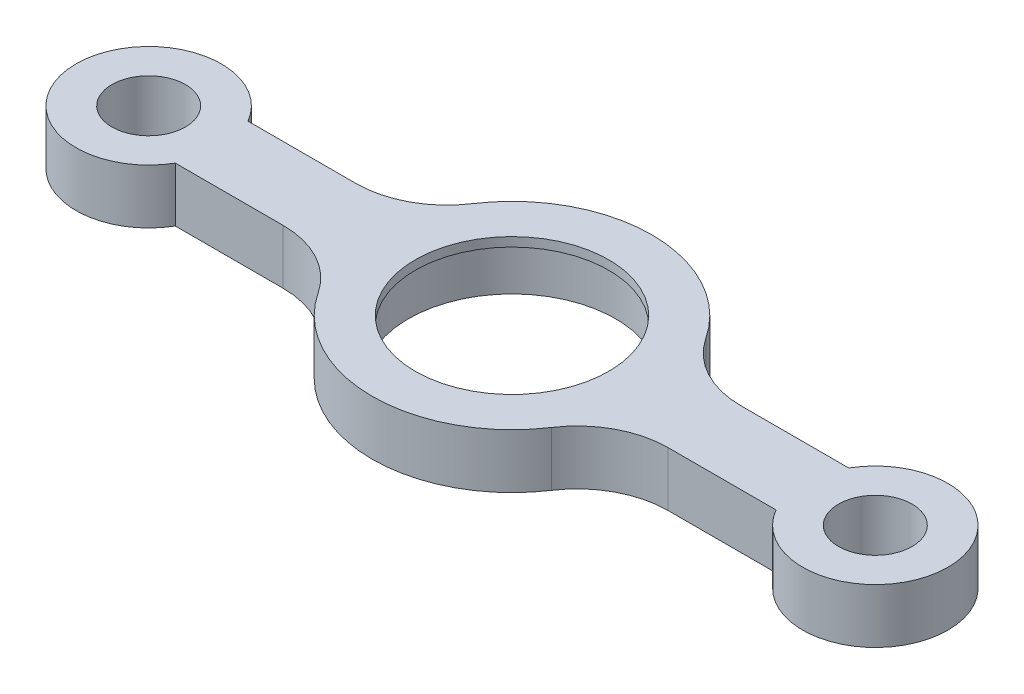
ISO-10303-21;
HEADER;
FILE_DESCRIPTION(('STEP AP214'),'2;1');
FILE_NAME('part.step','',(''),(''),'','','');
FILE_SCHEMA(('AUTOMOTIVE_DESIGN { 1 0 10303 214 1 1 1 1 }'));
ENDSEC;
DATA;
#1=APPLICATION_CONTEXT('core data for automotive mechanical design processes');
#2=APPLICATION_PROTOCOL_DEFINITION('international standard','automotive_design',2000,#1);
#3=PRODUCT_CONTEXT('',#1,'mechanical');
#4=PRODUCT('Part','Part','',(#3));
#5=PRODUCT_RELATED_PRODUCT_CATEGORY('part','',(#4));
#6=PRODUCT_DEFINITION_FORMATION('','',#4);
#7=PRODUCT_DEFINITION_CONTEXT('part definition',#1,'design');
#8=PRODUCT_DEFINITION('design','',#6,#7);
#9=PRODUCT_DEFINITION_SHAPE('','',#8);
#10=(LENGTH_UNIT() NAMED_UNIT(*) SI_UNIT(.MILLI.,.METRE.));
#11=(NAMED_UNIT(*) PLANE_ANGLE_UNIT() SI_UNIT($,.RADIAN.));
#12=(NAMED_UNIT(*) SI_UNIT($,.STERADIAN.) SOLID_ANGLE_UNIT());
#13=UNCERTAINTY_MEASURE_WITH_UNIT(LENGTH_MEASURE(1.E-05),#10,'distance_accuracy_value','');
#14=(GEOMETRIC_REPRESENTATION_CONTEXT(3) GLOBAL_UNCERTAINTY_ASSIGNED_CONTEXT((#13)) GLOBAL_UNIT_ASSIGNED_CONTEXT((#10,
#11,#12)) REPRESENTATION_CONTEXT('',''));
#15=CARTESIAN_POINT('',(0.,0.,0.));
#16=DIRECTION('',(0.,0.,1.));
#17=DIRECTION('',(1.,0.,0.));
#18=AXIS2_PLACEMENT_3D('',#15,#16,#17);
#19=CARTESIAN_POINT('',(0.,6.,0.));
#20=DIRECTION('',(0.,-1.,0.));
#21=DIRECTION('',(0.,0.,-1.));
#22=AXIS2_PLACEMENT_3D('',#19,#20,#21);
#23=CYLINDRICAL_SURFACE('',#22,11.4);
#24=CARTESIAN_POINT('',(0.,0.,0.));
#25=DIRECTION('',(0.,1.,0.));
#26=DIRECTION('',(0.,0.,1.));
#27=AXIS2_PLACEMENT_3D('',#24,#25,#26);
#28=CIRCLE('',#27,11.4);
#29=CARTESIAN_POINT('',(0.,0.,11.4));
#30=VERTEX_POINT('',#29);
#31=EDGE_CURVE('E375',#30,#30,#28,.T.);
#32=ORIENTED_EDGE('',*,*,#31,.F.);
#33=EDGE_LOOP('',(#32));
#34=FACE_BOUND('',#33,.T.);
#35=CARTESIAN_POINT('',(0.,5.,0.));
#36=DIRECTION('',(0.,1.,0.));
#37=DIRECTION('',(0.,0.,1.));
#38=AXIS2_PLACEMENT_3D('',#35,#36,#37);
#39=CIRCLE('',#38,11.4);
#40=CARTESIAN_POINT('',(0.,5.,11.4));
#41=VERTEX_POINT('',#40);
#42=EDGE_CURVE('E370',#41,#41,#39,.T.);
#43=ORIENTED_EDGE('',*,*,#42,.T.);
#44=EDGE_LOOP('',(#43));
#45=FACE_BOUND('',#44,.T.);
#46=ADVANCED_FACE('F33',(#34,#45),#23,.F.);
#47=CARTESIAN_POINT('',(-40.,6.,0.));
#48=DIRECTION('',(0.,1.,0.));
#49=DIRECTION('',(0.,0.,1.));
#50=AXIS2_PLACEMENT_3D('',#47,#48,#49);
#51=PLANE('',#50);
#52=CARTESIAN_POINT('',(-40.,6.,0.));
#53=DIRECTION('',(0.,1.,0.));
#54=DIRECTION('',(0.,0.,1.));
#55=AXIS2_PLACEMENT_3D('',#52,#53,#54);
#56=CIRCLE('',#55,4.05);
#57=CARTESIAN_POINT('',(-40.,6.,4.05));
#58=VERTEX_POINT('',#57);
#59=EDGE_CURVE('E379',#58,#58,#56,.T.);
#60=ORIENTED_EDGE('',*,*,#59,.F.);
#61=EDGE_LOOP('',(#60));
#62=FACE_BOUND('',#61,.T.);
#63=CARTESIAN_POINT('',(-40.,6.,0.));
#64=DIRECTION('',(0.,1.,0.));
#65=DIRECTION('',(0.,0.,1.));
#66=AXIS2_PLACEMENT_3D('',#63,#64,#65);
#67=CIRCLE('',#66,8.00000000000001);
#68=CARTESIAN_POINT('',(-33.0717967697245,6.,-3.99999999999998));
#69=VERTEX_POINT('',#68);
#70=CARTESIAN_POINT('',(-33.0717967697245,6.,4.));
#71=VERTEX_POINT('',#70);
#72=EDGE_CURVE('E178',#69,#71,#67,.T.);
#73=ORIENTED_EDGE('',*,*,#72,.T.);
#74=DIRECTION('',(1.,0.,0.));
#75=VECTOR('',#74,1.);
#76=CARTESIAN_POINT('',(-33.0717967697245,6.,4.));
#77=LINE('',#76,#75);
#78=CARTESIAN_POINT('',(-21.193395197561,6.,4.));
#79=VERTEX_POINT('',#78);
#80=EDGE_CURVE('E105',#71,#79,#77,.T.);
#81=ORIENTED_EDGE('',*,*,#80,.T.);
#82=CARTESIAN_POINT('',(-21.193395197561,6.,14.));
#83=DIRECTION('',(0.,-1.,0.));
#84=DIRECTION('',(0.,0.,1.));
#85=AXIS2_PLACEMENT_3D('',#82,#83,#84);
#86=CIRCLE('',#85,10.);
#87=CARTESIAN_POINT('',(-12.8495388205685,6.,8.48818897637796));
#88=VERTEX_POINT('',#87);
#89=EDGE_CURVE('E205',#79,#88,#86,.T.);
#90=ORIENTED_EDGE('',*,*,#89,.T.);
#91=CARTESIAN_POINT('',(0.,6.,0.));
#92=DIRECTION('',(0.,1.,0.));
#93=DIRECTION('',(0.,0.,1.));
#94=AXIS2_PLACEMENT_3D('',#91,#92,#93);
#95=CIRCLE('',#94,15.4);
#96=CARTESIAN_POINT('',(12.8495388205685,6.,8.48818897637795));
#97=VERTEX_POINT('',#96);
#98=EDGE_CURVE('E224',#88,#97,#95,.T.);
#99=ORIENTED_EDGE('',*,*,#98,.T.);
#100=CARTESIAN_POINT('',(21.193395197561,6.,14.));
#101=DIRECTION('',(0.,-1.,0.));
#102=DIRECTION('',(0.,0.,1.));
#103=AXIS2_PLACEMENT_3D('',#100,#101,#102);
#104=CIRCLE('',#103,10.);
#105=CARTESIAN_POINT('',(21.193395197561,6.,4.));
#106=VERTEX_POINT('',#105);
#107=EDGE_CURVE('E221',#97,#106,#104,.T.);
#108=ORIENTED_EDGE('',*,*,#107,.T.);
#109=DIRECTION('',(1.,0.,0.));
#110=VECTOR('',#109,1.);
#111=CARTESIAN_POINT('',(21.193395197561,6.,4.));
#112=LINE('',#111,#110);
#113=CARTESIAN_POINT('',(33.0717967697245,6.,3.99999999999999));
#114=VERTEX_POINT('',#113);
#115=EDGE_CURVE('E223',#106,#114,#112,.T.);
#116=ORIENTED_EDGE('',*,*,#115,.T.);
#117=CARTESIAN_POINT('',(40.,6.,0.));
#118=DIRECTION('',(0.,1.,0.));
#119=DIRECTION('',(0.,0.,1.));
#120=AXIS2_PLACEMENT_3D('',#117,#118,#119);
#121=CIRCLE('',#120,8.00000000000001);
#122=CARTESIAN_POINT('',(33.0717967697245,6.,-3.99999999999999));
#123=VERTEX_POINT('',#122);
#124=EDGE_CURVE('E226',#114,#123,#121,.T.);
#125=ORIENTED_EDGE('',*,*,#124,.T.);
#126=DIRECTION('',(-1.,0.,0.));
#127=VECTOR('',#126,1.);
#128=CARTESIAN_POINT('',(21.193395197561,6.,-4.));
#129=LINE('',#128,#127);
#130=CARTESIAN_POINT('',(21.193395197561,6.,-4.));
#131=VERTEX_POINT('',#130);
#132=EDGE_CURVE('E232',#123,#131,#129,.T.);
#133=ORIENTED_EDGE('',*,*,#132,.T.);
#134=CARTESIAN_POINT('',(21.193395197561,6.,-14.));
#135=DIRECTION('',(0.,-1.,0.));
#136=DIRECTION('',(0.,0.,-1.));
#137=AXIS2_PLACEMENT_3D('',#134,#135,#136);
#138=CIRCLE('',#137,10.);
#139=CARTESIAN_POINT('',(12.8495388205685,6.,-8.48818897637795));
#140=VERTEX_POINT('',#139);
#141=EDGE_CURVE('E137',#131,#140,#138,.T.);
#142=ORIENTED_EDGE('',*,*,#141,.T.);
#143=CARTESIAN_POINT('',(0.,6.,0.));
#144=DIRECTION('',(0.,1.,0.));
#145=DIRECTION('',(0.,0.,1.));
#146=AXIS2_PLACEMENT_3D('',#143,#144,#145);
#147=CIRCLE('',#146,15.4);
#148=CARTESIAN_POINT('',(-12.8495388205685,6.,-8.48818897637796));
#149=VERTEX_POINT('',#148);
#150=EDGE_CURVE('E130',#140,#149,#147,.T.);
#151=ORIENTED_EDGE('',*,*,#150,.T.);
#152=CARTESIAN_POINT('',(-21.193395197561,6.,-14.));
#153=DIRECTION('',(0.,-1.,0.));
#154=DIRECTION('',(0.,0.,-1.));
#155=AXIS2_PLACEMENT_3D('',#152,#153,#154);
#156=CIRCLE('',#155,10.);
#157=CARTESIAN_POINT('',(-21.193395197561,6.,-4.));
#158=VERTEX_POINT('',#157);
#159=EDGE_CURVE('E135',#149,#158,#156,.T.);
#160=ORIENTED_EDGE('',*,*,#159,.T.);
#161=DIRECTION('',(-1.,0.,0.));
#162=VECTOR('',#161,1.);
#163=CARTESIAN_POINT('',(-33.0717967697245,6.,-3.99999999999998));
#164=LINE('',#163,#162);
#165=EDGE_CURVE('E50',#158,#69,#164,.T.);
#166=ORIENTED_EDGE('',*,*,#165,.T.);
#167=EDGE_LOOP('',(#73,#81,#90,#99,#108,#116,#125,#133,#142,#151,#160,#166));
#168=FACE_BOUND('',#167,.T.);
#169=CARTESIAN_POINT('',(40.,6.,0.));
#170=DIRECTION('',(0.,1.,0.));
#171=DIRECTION('',(0.,0.,1.));
#172=AXIS2_PLACEMENT_3D('',#169,#170,#171);
#173=CIRCLE('',#172,4.05);
#174=CARTESIAN_POINT('',(40.,6.,4.05));
#175=VERTEX_POINT('',#174);
#176=EDGE_CURVE('E159',#175,#175,#173,.T.);
#177=ORIENTED_EDGE('',*,*,#176,.F.);
#178=EDGE_LOOP('',(#177));
#179=FACE_BOUND('',#178,.T.);
#180=CARTESIAN_POINT('',(0.,6.,0.));
#181=DIRECTION('',(0.,1.,0.));
#182=DIRECTION('',(0.,0.,1.));
#183=AXIS2_PLACEMENT_3D('',#180,#181,#182);
#184=CIRCLE('',#183,10.65);
#185=CARTESIAN_POINT('',(0.,6.,10.65));
#186=VERTEX_POINT('',#185);
#187=EDGE_CURVE('E367',#186,#186,#184,.T.);
#188=ORIENTED_EDGE('',*,*,#187,.F.);
#189=EDGE_LOOP('',(#188));
#190=FACE_BOUND('',#189,.T.);
#191=ADVANCED_FACE('F132',(#62,#168,#179,#190),#51,.T.);
#192=CARTESIAN_POINT('',(-40.,0.,0.));
#193=DIRECTION('',(0.,1.,0.));
#194=DIRECTION('',(0.,0.,1.));
#195=AXIS2_PLACEMENT_3D('',#192,#193,#194);
#196=PLANE('',#195);
#197=CARTESIAN_POINT('',(-40.,0.,0.));
#198=DIRECTION('',(0.,1.,0.));
#199=DIRECTION('',(0.,0.,1.));
#200=AXIS2_PLACEMENT_3D('',#197,#198,#199);
#201=CIRCLE('',#200,8.00000000000001);
#202=CARTESIAN_POINT('',(-33.0717967697245,0.,-3.99999999999998));
#203=VERTEX_POINT('',#202);
#204=CARTESIAN_POINT('',(-33.0717967697245,0.,4.));
#205=VERTEX_POINT('',#204);
#206=EDGE_CURVE('E155',#203,#205,#201,.T.);
#207=ORIENTED_EDGE('',*,*,#206,.F.);
#208=DIRECTION('',(-1.,0.,0.));
#209=VECTOR('',#208,1.);
#210=CARTESIAN_POINT('',(-33.0717967697245,0.,-3.99999999999998));
#211=LINE('',#210,#209);
#212=CARTESIAN_POINT('',(-21.193395197561,0.,-4.));
#213=VERTEX_POINT('',#212);
#214=EDGE_CURVE('E97',#213,#203,#211,.T.);
#215=ORIENTED_EDGE('',*,*,#214,.F.);
#216=CARTESIAN_POINT('',(-21.193395197561,0.,-14.));
#217=DIRECTION('',(0.,-1.,0.));
#218=DIRECTION('',(0.,0.,-1.));
#219=AXIS2_PLACEMENT_3D('',#216,#217,#218);
#220=CIRCLE('',#219,10.);
#221=CARTESIAN_POINT('',(-12.8495388205685,0.,-8.48818897637796));
#222=VERTEX_POINT('',#221);
#223=EDGE_CURVE('E91',#222,#213,#220,.T.);
#224=ORIENTED_EDGE('',*,*,#223,.F.);
#225=CARTESIAN_POINT('',(0.,0.,0.));
#226=DIRECTION('',(0.,1.,0.));
#227=DIRECTION('',(0.,0.,1.));
#228=AXIS2_PLACEMENT_3D('',#225,#226,#227);
#229=CIRCLE('',#228,15.4);
#230=CARTESIAN_POINT('',(12.8495388205685,0.,-8.48818897637795));
#231=VERTEX_POINT('',#230);
#232=EDGE_CURVE('E145',#231,#222,#229,.T.);
#233=ORIENTED_EDGE('',*,*,#232,.F.);
#234=CARTESIAN_POINT('',(21.193395197561,0.,-14.));
#235=DIRECTION('',(0.,-1.,0.));
#236=DIRECTION('',(0.,0.,-1.));
#237=AXIS2_PLACEMENT_3D('',#234,#235,#236);
#238=CIRCLE('',#237,10.);
#239=CARTESIAN_POINT('',(21.193395197561,0.,-4.));
#240=VERTEX_POINT('',#239);
#241=EDGE_CURVE('E173',#240,#231,#238,.T.);
#242=ORIENTED_EDGE('',*,*,#241,.F.);
#243=DIRECTION('',(-1.,0.,0.));
#244=VECTOR('',#243,1.);
#245=CARTESIAN_POINT('',(21.193395197561,0.,-4.));
#246=LINE('',#245,#244);
#247=CARTESIAN_POINT('',(33.0717967697245,0.,-3.99999999999999));
#248=VERTEX_POINT('',#247);
#249=EDGE_CURVE('E171',#248,#240,#246,.T.);
#250=ORIENTED_EDGE('',*,*,#249,.F.);
#251=CARTESIAN_POINT('',(40.,0.,0.));
#252=DIRECTION('',(0.,1.,0.));
#253=DIRECTION('',(0.,0.,1.));
#254=AXIS2_PLACEMENT_3D('',#251,#252,#253);
#255=CIRCLE('',#254,8.00000000000001);
#256=CARTESIAN_POINT('',(33.0717967697245,0.,3.99999999999999));
#257=VERTEX_POINT('',#256);
#258=EDGE_CURVE('E169',#257,#248,#255,.T.);
#259=ORIENTED_EDGE('',*,*,#258,.F.);
#260=DIRECTION('',(1.,0.,0.));
#261=VECTOR('',#260,1.);
#262=CARTESIAN_POINT('',(21.193395197561,0.,4.));
#263=LINE('',#262,#261);
#264=CARTESIAN_POINT('',(21.193395197561,0.,4.));
#265=VERTEX_POINT('',#264);
#266=EDGE_CURVE('E167',#265,#257,#263,.T.);
#267=ORIENTED_EDGE('',*,*,#266,.F.);
#268=CARTESIAN_POINT('',(21.193395197561,0.,14.));
#269=DIRECTION('',(0.,-1.,0.));
#270=DIRECTION('',(0.,0.,1.));
#271=AXIS2_PLACEMENT_3D('',#268,#269,#270);
#272=CIRCLE('',#271,10.);
#273=CARTESIAN_POINT('',(12.8495388205685,0.,8.48818897637795));
#274=VERTEX_POINT('',#273);
#275=EDGE_CURVE('E165',#274,#265,#272,.T.);
#276=ORIENTED_EDGE('',*,*,#275,.F.);
#277=CARTESIAN_POINT('',(0.,0.,0.));
#278=DIRECTION('',(0.,1.,0.));
#279=DIRECTION('',(0.,0.,1.));
#280=AXIS2_PLACEMENT_3D('',#277,#278,#279);
#281=CIRCLE('',#280,15.4);
#282=CARTESIAN_POINT('',(-12.8495388205685,0.,8.48818897637796));
#283=VERTEX_POINT('',#282);
#284=EDGE_CURVE('E163',#283,#274,#281,.T.);
#285=ORIENTED_EDGE('',*,*,#284,.F.);
#286=CARTESIAN_POINT('',(-21.193395197561,0.,14.));
#287=DIRECTION('',(0.,-1.,0.));
#288=DIRECTION('',(0.,0.,1.));
#289=AXIS2_PLACEMENT_3D('',#286,#287,#288);
#290=CIRCLE('',#289,10.);
#291=CARTESIAN_POINT('',(-21.193395197561,0.,4.));
#292=VERTEX_POINT('',#291);
#293=EDGE_CURVE('E161',#292,#283,#290,.T.);
#294=ORIENTED_EDGE('',*,*,#293,.F.);
#295=DIRECTION('',(1.,0.,0.));
#296=VECTOR('',#295,1.);
#297=CARTESIAN_POINT('',(-33.0717967697245,0.,4.));
#298=LINE('',#297,#296);
#299=EDGE_CURVE('E158',#205,#292,#298,.T.);
#300=ORIENTED_EDGE('',*,*,#299,.F.);
#301=EDGE_LOOP('',(#207,#215,#224,#233,#242,#250,#259,#267,#276,#285,#294,#300));
#302=FACE_BOUND('',#301,.T.);
#303=CARTESIAN_POINT('',(40.,0.,0.));
#304=DIRECTION('',(0.,1.,0.));
#305=DIRECTION('',(0.,0.,1.));
#306=AXIS2_PLACEMENT_3D('',#303,#304,#305);
#307=CIRCLE('',#306,4.05);
#308=CARTESIAN_POINT('',(40.,0.,4.05));
#309=VERTEX_POINT('',#308);
#310=EDGE_CURVE('E382',#309,#309,#307,.T.);
#311=ORIENTED_EDGE('',*,*,#310,.T.);
#312=EDGE_LOOP('',(#311));
#313=FACE_BOUND('',#312,.T.);
#314=CARTESIAN_POINT('',(-40.,0.,0.));
#315=DIRECTION('',(0.,1.,0.));
#316=DIRECTION('',(0.,0.,1.));
#317=AXIS2_PLACEMENT_3D('',#314,#315,#316);
#318=CIRCLE('',#317,4.05);
#319=CARTESIAN_POINT('',(-40.,0.,4.05));
#320=VERTEX_POINT('',#319);
#321=EDGE_CURVE('E378',#320,#320,#318,.T.);
#322=ORIENTED_EDGE('',*,*,#321,.T.);
#323=EDGE_LOOP('',(#322));
#324=FACE_BOUND('',#323,.T.);
#325=ORIENTED_EDGE('',*,*,#31,.T.);
#326=EDGE_LOOP('',(#325));
#327=FACE_BOUND('',#326,.T.);
#328=ADVANCED_FACE('F209',(#302,#313,#324,#327),#196,.F.);
#329=CARTESIAN_POINT('',(-40.,6.,0.));
#330=DIRECTION('',(0.,-1.,0.));
#331=DIRECTION('',(0.,0.,-1.));
#332=AXIS2_PLACEMENT_3D('',#329,#330,#331);
#333=CYLINDRICAL_SURFACE('',#332,8.00000000000001);
#334=ORIENTED_EDGE('',*,*,#206,.T.);
#335=DIRECTION('',(0.,-1.,0.));
#336=VECTOR('',#335,1.);
#337=CARTESIAN_POINT('',(-33.0717967697245,6.,4.));
#338=LINE('',#337,#336);
#339=EDGE_CURVE('E11',#71,#205,#338,.T.);
#340=ORIENTED_EDGE('',*,*,#339,.F.);
#341=ORIENTED_EDGE('',*,*,#72,.F.);
#342=DIRECTION('',(0.,-1.,0.));
#343=VECTOR('',#342,1.);
#344=CARTESIAN_POINT('',(-33.0717967697245,6.,-3.99999999999998));
#345=LINE('',#344,#343);
#346=EDGE_CURVE('E151',#69,#203,#345,.T.);
#347=ORIENTED_EDGE('',*,*,#346,.T.);
#348=EDGE_LOOP('',(#334,#340,#341,#347));
#349=FACE_BOUND('',#348,.T.);
#350=ADVANCED_FACE('F35',(#349),#333,.T.);
#351=CARTESIAN_POINT('',(-33.0717967697245,6.,4.));
#352=DIRECTION('',(0.,0.,-1.));
#353=DIRECTION('',(-1.,0.,0.));
#354=AXIS2_PLACEMENT_3D('',#351,#352,#353);
#355=PLANE('',#354);
#356=ORIENTED_EDGE('',*,*,#299,.T.);
#357=DIRECTION('',(0.,-1.,0.));
#358=VECTOR('',#357,1.);
#359=CARTESIAN_POINT('',(-21.193395197561,6.,4.));
#360=LINE('',#359,#358);
#361=EDGE_CURVE('E42',#79,#292,#360,.T.);
#362=ORIENTED_EDGE('',*,*,#361,.F.);
#363=ORIENTED_EDGE('',*,*,#80,.F.);
#364=ORIENTED_EDGE('',*,*,#339,.T.);
#365=EDGE_LOOP('',(#356,#362,#363,#364));
#366=FACE_BOUND('',#365,.T.);
#367=ADVANCED_FACE('F279',(#366),#355,.F.);
#368=CARTESIAN_POINT('',(-21.193395197561,6.,14.));
#369=DIRECTION('',(0.,-1.,0.));
#370=DIRECTION('',(0.,0.,-1.));
#371=AXIS2_PLACEMENT_3D('',#368,#369,#370);
#372=CYLINDRICAL_SURFACE('',#371,10.);
#373=ORIENTED_EDGE('',*,*,#293,.T.);
#374=DIRECTION('',(0.,-1.,0.));
#375=VECTOR('',#374,1.);
#376=CARTESIAN_POINT('',(-12.8495388205685,6.,8.48818897637796));
#377=LINE('',#376,#375);
#378=EDGE_CURVE('E197',#88,#283,#377,.T.);
#379=ORIENTED_EDGE('',*,*,#378,.F.);
#380=ORIENTED_EDGE('',*,*,#89,.F.);
#381=ORIENTED_EDGE('',*,*,#361,.T.);
#382=EDGE_LOOP('',(#373,#379,#380,#381));
#383=FACE_BOUND('',#382,.T.);
#384=ADVANCED_FACE('F203',(#383),#372,.F.);
#385=CARTESIAN_POINT('',(0.,6.,0.));
#386=DIRECTION('',(0.,-1.,0.));
#387=DIRECTION('',(0.,0.,-1.));
#388=AXIS2_PLACEMENT_3D('',#385,#386,#387);
#389=CYLINDRICAL_SURFACE('',#388,15.4);
#390=ORIENTED_EDGE('',*,*,#284,.T.);
#391=DIRECTION('',(0.,-1.,0.));
#392=VECTOR('',#391,1.);
#393=CARTESIAN_POINT('',(12.8495388205685,6.,8.48818897637795));
#394=LINE('',#393,#392);
#395=EDGE_CURVE('E194',#97,#274,#394,.T.);
#396=ORIENTED_EDGE('',*,*,#395,.F.);
#397=ORIENTED_EDGE('',*,*,#98,.F.);
#398=ORIENTED_EDGE('',*,*,#378,.T.);
#399=EDGE_LOOP('',(#390,#396,#397,#398));
#400=FACE_BOUND('',#399,.T.);
#401=ADVANCED_FACE('F215',(#400),#389,.T.);
#402=CARTESIAN_POINT('',(21.193395197561,6.,14.));
#403=DIRECTION('',(0.,-1.,0.));
#404=DIRECTION('',(0.,0.,-1.));
#405=AXIS2_PLACEMENT_3D('',#402,#403,#404);
#406=CYLINDRICAL_SURFACE('',#405,10.);
#407=ORIENTED_EDGE('',*,*,#275,.T.);
#408=DIRECTION('',(0.,-1.,0.));
#409=VECTOR('',#408,1.);
#410=CARTESIAN_POINT('',(21.193395197561,6.,4.));
#411=LINE('',#410,#409);
#412=EDGE_CURVE('E191',#106,#265,#411,.T.);
#413=ORIENTED_EDGE('',*,*,#412,.F.);
#414=ORIENTED_EDGE('',*,*,#107,.F.);
#415=ORIENTED_EDGE('',*,*,#395,.T.);
#416=EDGE_LOOP('',(#407,#413,#414,#415));
#417=FACE_BOUND('',#416,.T.);
#418=ADVANCED_FACE('F219',(#417),#406,.F.);
#419=CARTESIAN_POINT('',(21.193395197561,6.,4.));
#420=DIRECTION('',(0.,0.,-1.));
#421=DIRECTION('',(-1.,0.,0.));
#422=AXIS2_PLACEMENT_3D('',#419,#420,#421);
#423=PLANE('',#422);
#424=ORIENTED_EDGE('',*,*,#266,.T.);
#425=DIRECTION('',(0.,-1.,0.));
#426=VECTOR('',#425,1.);
#427=CARTESIAN_POINT('',(33.0717967697245,6.,3.99999999999999));
#428=LINE('',#427,#426);
#429=EDGE_CURVE('E188',#114,#257,#428,.T.);
#430=ORIENTED_EDGE('',*,*,#429,.F.);
#431=ORIENTED_EDGE('',*,*,#115,.F.);
#432=ORIENTED_EDGE('',*,*,#412,.T.);
#433=EDGE_LOOP('',(#424,#430,#431,#432));
#434=FACE_BOUND('',#433,.T.);
#435=ADVANCED_FACE('F292',(#434),#423,.F.);
#436=CARTESIAN_POINT('',(40.,6.,0.));
#437=DIRECTION('',(0.,-1.,0.));
#438=DIRECTION('',(0.,0.,-1.));
#439=AXIS2_PLACEMENT_3D('',#436,#437,#438);
#440=CYLINDRICAL_SURFACE('',#439,8.00000000000001);
#441=ORIENTED_EDGE('',*,*,#258,.T.);
#442=DIRECTION('',(0.,-1.,0.));
#443=VECTOR('',#442,1.);
#444=CARTESIAN_POINT('',(33.0717967697245,6.,-3.99999999999999));
#445=LINE('',#444,#443);
#446=EDGE_CURVE('E185',#123,#248,#445,.T.);
#447=ORIENTED_EDGE('',*,*,#446,.F.);
#448=ORIENTED_EDGE('',*,*,#124,.F.);
#449=ORIENTED_EDGE('',*,*,#429,.T.);
#450=EDGE_LOOP('',(#441,#447,#448,#449));
#451=FACE_BOUND('',#450,.T.);
#452=ADVANCED_FACE('F295',(#451),#440,.T.);
#453=CARTESIAN_POINT('',(21.193395197561,6.,-4.));
#454=DIRECTION('',(0.,0.,1.));
#455=DIRECTION('',(1.,0.,0.));
#456=AXIS2_PLACEMENT_3D('',#453,#454,#455);
#457=PLANE('',#456);
#458=ORIENTED_EDGE('',*,*,#249,.T.);
#459=DIRECTION('',(0.,-1.,0.));
#460=VECTOR('',#459,1.);
#461=CARTESIAN_POINT('',(21.193395197561,6.,-4.));
#462=LINE('',#461,#460);
#463=EDGE_CURVE('E182',#131,#240,#462,.T.);
#464=ORIENTED_EDGE('',*,*,#463,.F.);
#465=ORIENTED_EDGE('',*,*,#132,.F.);
#466=ORIENTED_EDGE('',*,*,#446,.T.);
#467=EDGE_LOOP('',(#458,#464,#465,#466));
#468=FACE_BOUND('',#467,.T.);
#469=ADVANCED_FACE('F238',(#468),#457,.F.);
#470=CARTESIAN_POINT('',(21.193395197561,6.,-14.));
#471=DIRECTION('',(0.,-1.,0.));
#472=DIRECTION('',(0.,0.,-1.));
#473=AXIS2_PLACEMENT_3D('',#470,#471,#472);
#474=CYLINDRICAL_SURFACE('',#473,10.);
#475=ORIENTED_EDGE('',*,*,#241,.T.);
#476=DIRECTION('',(0.,-1.,0.));
#477=VECTOR('',#476,1.);
#478=CARTESIAN_POINT('',(12.8495388205685,6.,-8.48818897637795));
#479=LINE('',#478,#477);
#480=EDGE_CURVE('E146',#140,#231,#479,.T.);
#481=ORIENTED_EDGE('',*,*,#480,.F.);
#482=ORIENTED_EDGE('',*,*,#141,.F.);
#483=ORIENTED_EDGE('',*,*,#463,.T.);
#484=EDGE_LOOP('',(#475,#481,#482,#483));
#485=FACE_BOUND('',#484,.T.);
#486=ADVANCED_FACE('F242',(#485),#474,.F.);
#487=CARTESIAN_POINT('',(0.,6.,0.));
#488=DIRECTION('',(0.,-1.,0.));
#489=DIRECTION('',(0.,0.,-1.));
#490=AXIS2_PLACEMENT_3D('',#487,#488,#489);
#491=CYLINDRICAL_SURFACE('',#490,15.4);
#492=ORIENTED_EDGE('',*,*,#232,.T.);
#493=DIRECTION('',(0.,-1.,0.));
#494=VECTOR('',#493,1.);
#495=CARTESIAN_POINT('',(-12.8495388205685,6.,-8.48818897637796));
#496=LINE('',#495,#494);
#497=EDGE_CURVE('E142',#149,#222,#496,.T.);
#498=ORIENTED_EDGE('',*,*,#497,.F.);
#499=ORIENTED_EDGE('',*,*,#150,.F.);
#500=ORIENTED_EDGE('',*,*,#480,.T.);
#501=EDGE_LOOP('',(#492,#498,#499,#500));
#502=FACE_BOUND('',#501,.T.);
#503=ADVANCED_FACE('F143',(#502),#491,.T.);
#504=CARTESIAN_POINT('',(-21.193395197561,6.,-14.));
#505=DIRECTION('',(0.,-1.,0.));
#506=DIRECTION('',(0.,0.,-1.));
#507=AXIS2_PLACEMENT_3D('',#504,#505,#506);
#508=CYLINDRICAL_SURFACE('',#507,10.);
#509=ORIENTED_EDGE('',*,*,#223,.T.);
#510=DIRECTION('',(0.,-1.,0.));
#511=VECTOR('',#510,1.);
#512=CARTESIAN_POINT('',(-21.193395197561,6.,-4.));
#513=LINE('',#512,#511);
#514=EDGE_CURVE('E147',#158,#213,#513,.T.);
#515=ORIENTED_EDGE('',*,*,#514,.F.);
#516=ORIENTED_EDGE('',*,*,#159,.F.);
#517=ORIENTED_EDGE('',*,*,#497,.T.);
#518=EDGE_LOOP('',(#509,#515,#516,#517));
#519=FACE_BOUND('',#518,.T.);
#520=ADVANCED_FACE('F149',(#519),#508,.F.);
#521=CARTESIAN_POINT('',(-33.0717967697245,6.,-3.99999999999998));
#522=DIRECTION('',(0.,0.,1.));
#523=DIRECTION('',(1.,0.,0.));
#524=AXIS2_PLACEMENT_3D('',#521,#522,#523);
#525=PLANE('',#524);
#526=ORIENTED_EDGE('',*,*,#214,.T.);
#527=ORIENTED_EDGE('',*,*,#346,.F.);
#528=ORIENTED_EDGE('',*,*,#165,.F.);
#529=ORIENTED_EDGE('',*,*,#514,.T.);
#530=EDGE_LOOP('',(#526,#527,#528,#529));
#531=FACE_BOUND('',#530,.T.);
#532=ADVANCED_FACE('F246',(#531),#525,.F.);
#533=CARTESIAN_POINT('',(40.,6.,0.));
#534=DIRECTION('',(0.,-1.,0.));
#535=DIRECTION('',(0.,0.,-1.));
#536=AXIS2_PLACEMENT_3D('',#533,#534,#535);
#537=CYLINDRICAL_SURFACE('',#536,4.05);
#538=ORIENTED_EDGE('',*,*,#176,.T.);
#539=EDGE_LOOP('',(#538));
#540=FACE_BOUND('',#539,.T.);
#541=ORIENTED_EDGE('',*,*,#310,.F.);
#542=EDGE_LOOP('',(#541));
#543=FACE_BOUND('',#542,.T.);
#544=ADVANCED_FACE('F248',(#540,#543),#537,.F.);
#545=CARTESIAN_POINT('',(-40.,6.,0.));
#546=DIRECTION('',(0.,-1.,0.));
#547=DIRECTION('',(0.,0.,-1.));
#548=AXIS2_PLACEMENT_3D('',#545,#546,#547);
#549=CYLINDRICAL_SURFACE('',#548,4.05);
#550=ORIENTED_EDGE('',*,*,#59,.T.);
#551=EDGE_LOOP('',(#550));
#552=FACE_BOUND('',#551,.T.);
#553=ORIENTED_EDGE('',*,*,#321,.F.);
#554=EDGE_LOOP('',(#553));
#555=FACE_BOUND('',#554,.T.);
#556=ADVANCED_FACE('F254',(#552,#555),#549,.F.);
#557=CARTESIAN_POINT('',(0.,5.,0.));
#558=DIRECTION('',(0.,1.,0.));
#559=DIRECTION('',(0.,0.,1.));
#560=AXIS2_PLACEMENT_3D('',#557,#558,#559);
#561=PLANE('',#560);
#562=CARTESIAN_POINT('',(0.,5.,0.));
#563=DIRECTION('',(0.,1.,0.));
#564=DIRECTION('',(0.,0.,1.));
#565=AXIS2_PLACEMENT_3D('',#562,#563,#564);
#566=CIRCLE('',#565,10.65);
#567=CARTESIAN_POINT('',(0.,5.,10.65));
#568=VERTEX_POINT('',#567);
#569=EDGE_CURVE('E364',#568,#568,#566,.T.);
#570=ORIENTED_EDGE('',*,*,#569,.T.);
#571=EDGE_LOOP('',(#570));
#572=FACE_BOUND('',#571,.T.);
#573=ORIENTED_EDGE('',*,*,#42,.F.);
#574=EDGE_LOOP('',(#573));
#575=FACE_BOUND('',#574,.T.);
#576=ADVANCED_FACE('F271',(#572,#575),#561,.F.);
#577=CARTESIAN_POINT('',(0.,5.,0.));
#578=DIRECTION('',(0.,1.,0.));
#579=DIRECTION('',(0.,0.,1.));
#580=AXIS2_PLACEMENT_3D('',#577,#578,#579);
#581=CYLINDRICAL_SURFACE('',#580,10.65);
#582=ORIENTED_EDGE('',*,*,#569,.F.);
#583=EDGE_LOOP('',(#582));
#584=FACE_BOUND('',#583,.T.);
#585=ORIENTED_EDGE('',*,*,#187,.T.);
#586=EDGE_LOOP('',(#585));
#587=FACE_BOUND('',#586,.T.);
#588=ADVANCED_FACE('F349',(#584,#587),#581,.F.);
#589=CLOSED_SHELL('',(#46,#191,#328,#350,#367,#384,#401,#418,#435,#452,#469,#486,#503,#520,#532,
#544,#556,#576,#588));
#590=MANIFOLD_SOLID_BREP('B2',#589);
#591=ADVANCED_BREP_SHAPE_REPRESENTATION('',(#18,#590),#14);
#592=SHAPE_DEFINITION_REPRESENTATION(#9,#591);
ENDSEC;
END-ISO-10303-21;
